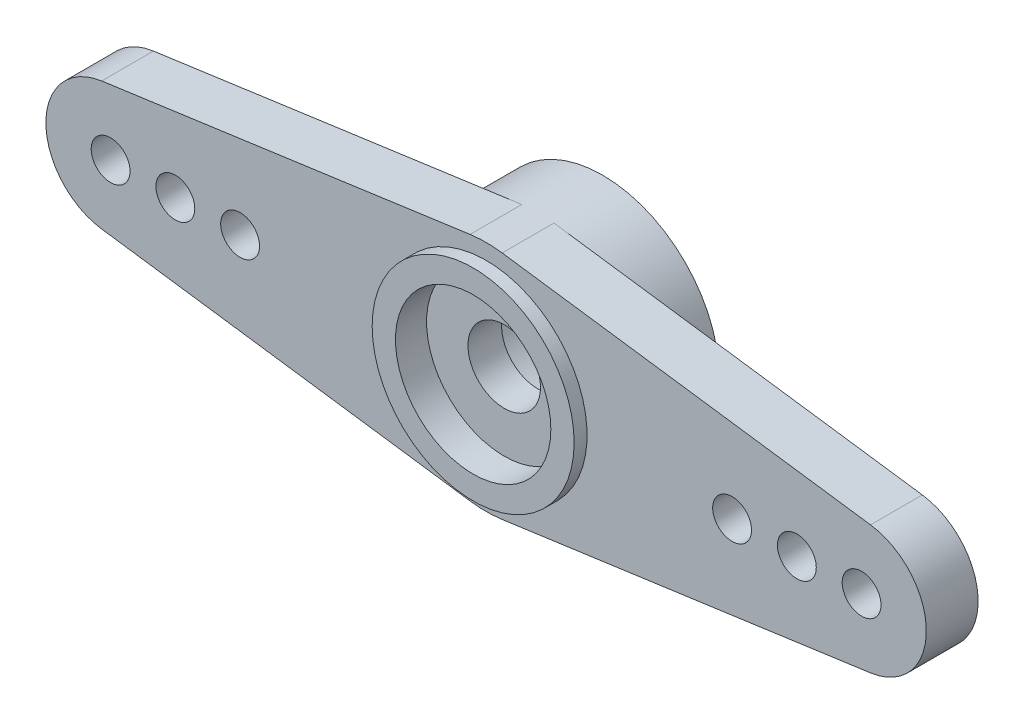
ISO-10303-21;
HEADER;
FILE_DESCRIPTION(('STEP AP214'),'2;1');
FILE_NAME('part.step','',(''),(''),'','','');
FILE_SCHEMA(('AUTOMOTIVE_DESIGN { 1 0 10303 214 1 1 1 1 }'));
ENDSEC;
DATA;
#1=APPLICATION_CONTEXT('core data for automotive mechanical design processes');
#2=APPLICATION_PROTOCOL_DEFINITION('international standard','automotive_design',2000,#1);
#3=PRODUCT_CONTEXT('',#1,'mechanical');
#4=PRODUCT('Part','Part','',(#3));
#5=PRODUCT_RELATED_PRODUCT_CATEGORY('part','',(#4));
#6=PRODUCT_DEFINITION_FORMATION('','',#4);
#7=PRODUCT_DEFINITION_CONTEXT('part definition',#1,'design');
#8=PRODUCT_DEFINITION('design','',#6,#7);
#9=PRODUCT_DEFINITION_SHAPE('','',#8);
#10=(LENGTH_UNIT() NAMED_UNIT(*) SI_UNIT(.MILLI.,.METRE.));
#11=(NAMED_UNIT(*) PLANE_ANGLE_UNIT() SI_UNIT($,.RADIAN.));
#12=(NAMED_UNIT(*) SI_UNIT($,.STERADIAN.) SOLID_ANGLE_UNIT());
#13=UNCERTAINTY_MEASURE_WITH_UNIT(LENGTH_MEASURE(1.E-05),#10,'distance_accuracy_value','');
#14=(GEOMETRIC_REPRESENTATION_CONTEXT(3) GLOBAL_UNCERTAINTY_ASSIGNED_CONTEXT((#13)) GLOBAL_UNIT_ASSIGNED_CONTEXT((#10,
#11,#12)) REPRESENTATION_CONTEXT('',''));
#15=CARTESIAN_POINT('',(0.,0.,0.));
#16=DIRECTION('',(0.,0.,1.));
#17=DIRECTION('',(1.,0.,0.));
#18=AXIS2_PLACEMENT_3D('',#15,#16,#17);
#19=CARTESIAN_POINT('',(0.,0.,0.));
#20=DIRECTION('',(0.,0.,-1.));
#21=DIRECTION('',(-1.,0.,0.));
#22=AXIS2_PLACEMENT_3D('',#19,#20,#21);
#23=PLANE('',#22);
#24=CARTESIAN_POINT('',(0.,0.,0.));
#25=DIRECTION('',(0.,0.,-1.));
#26=DIRECTION('',(-1.,0.,0.));
#27=AXIS2_PLACEMENT_3D('',#24,#25,#26);
#28=CIRCLE('',#27,4.5);
#29=CARTESIAN_POINT('',(0.620689655172413,4.45698826024502,0.));
#30=VERTEX_POINT('',#29);
#31=CARTESIAN_POINT('',(0.620689655172414,-4.45698826024502,0.));
#32=VERTEX_POINT('',#31);
#33=EDGE_CURVE('E11',#30,#32,#28,.T.);
#34=ORIENTED_EDGE('',*,*,#33,.F.);
#35=DIRECTION('',(-0.990441835610005,0.137931034482759,0.));
#36=VECTOR('',#35,1.);
#37=CARTESIAN_POINT('',(14.8448275862069,2.47610458902501,0.));
#38=LINE('',#37,#36);
#39=CARTESIAN_POINT('',(14.8448275862069,2.47610458902501,0.));
#40=VERTEX_POINT('',#39);
#41=EDGE_CURVE('E140',#40,#30,#38,.T.);
#42=ORIENTED_EDGE('',*,*,#41,.F.);
#43=CARTESIAN_POINT('',(14.5,0.,0.));
#44=DIRECTION('',(0.,0.,1.));
#45=DIRECTION('',(-1.,0.,0.));
#46=AXIS2_PLACEMENT_3D('',#43,#44,#45);
#47=CIRCLE('',#46,2.5);
#48=CARTESIAN_POINT('',(14.8448275862069,-2.47610458902501,0.));
#49=VERTEX_POINT('',#48);
#50=EDGE_CURVE('E78',#49,#40,#47,.T.);
#51=ORIENTED_EDGE('',*,*,#50,.F.);
#52=DIRECTION('',(0.990441835610005,0.137931034482759,0.));
#53=VECTOR('',#52,1.);
#54=CARTESIAN_POINT('',(0.620689655172413,-4.45698826024502,0.));
#55=LINE('',#54,#53);
#56=EDGE_CURVE('E120',#32,#49,#55,.T.);
#57=ORIENTED_EDGE('',*,*,#56,.F.);
#58=EDGE_LOOP('',(#34,#42,#51,#57));
#59=FACE_BOUND('',#58,.T.);
#60=CARTESIAN_POINT('',(12.,0.,0.));
#61=DIRECTION('',(0.,0.,1.));
#62=DIRECTION('',(1.,0.,0.));
#63=AXIS2_PLACEMENT_3D('',#60,#61,#62);
#64=CIRCLE('',#63,0.75);
#65=CARTESIAN_POINT('',(12.75,0.,0.));
#66=VERTEX_POINT('',#65);
#67=EDGE_CURVE('E177',#66,#66,#64,.T.);
#68=ORIENTED_EDGE('',*,*,#67,.T.);
#69=EDGE_LOOP('',(#68));
#70=FACE_BOUND('',#69,.T.);
#71=CARTESIAN_POINT('',(14.5,0.,0.));
#72=DIRECTION('',(0.,0.,1.));
#73=DIRECTION('',(1.,0.,0.));
#74=AXIS2_PLACEMENT_3D('',#71,#72,#73);
#75=CIRCLE('',#74,0.75);
#76=CARTESIAN_POINT('',(15.25,0.,0.));
#77=VERTEX_POINT('',#76);
#78=EDGE_CURVE('E208',#77,#77,#75,.T.);
#79=ORIENTED_EDGE('',*,*,#78,.T.);
#80=EDGE_LOOP('',(#79));
#81=FACE_BOUND('',#80,.T.);
#82=CARTESIAN_POINT('',(9.5,0.,0.));
#83=DIRECTION('',(0.,0.,1.));
#84=DIRECTION('',(1.,0.,0.));
#85=AXIS2_PLACEMENT_3D('',#82,#83,#84);
#86=CIRCLE('',#85,0.75);
#87=CARTESIAN_POINT('',(10.25,0.,0.));
#88=VERTEX_POINT('',#87);
#89=EDGE_CURVE('E181',#88,#88,#86,.T.);
#90=ORIENTED_EDGE('',*,*,#89,.T.);
#91=EDGE_LOOP('',(#90));
#92=FACE_BOUND('',#91,.T.);
#93=ADVANCED_FACE('F32',(#59,#70,#81,#92),#23,.T.);
#94=CARTESIAN_POINT('',(0.,0.,0.));
#95=DIRECTION('',(0.,0.,1.));
#96=DIRECTION('',(1.,0.,0.));
#97=AXIS2_PLACEMENT_3D('',#94,#95,#96);
#98=CIRCLE('',#97,1.4);
#99=CARTESIAN_POINT('',(1.4,0.,0.));
#100=VERTEX_POINT('',#99);
#101=EDGE_CURVE('E199',#100,#100,#98,.T.);
#102=ORIENTED_EDGE('',*,*,#101,.T.);
#103=EDGE_LOOP('',(#102));
#104=FACE_BOUND('',#103,.T.);
#105=CARTESIAN_POINT('',(0.,0.,0.));
#106=DIRECTION('',(0.,0.,-1.));
#107=DIRECTION('',(-1.,0.,0.));
#108=AXIS2_PLACEMENT_3D('',#105,#106,#107);
#109=CIRCLE('',#108,2.75);
#110=CARTESIAN_POINT('',(-2.75,0.,0.));
#111=VERTEX_POINT('',#110);
#112=EDGE_CURVE('E460',#111,#111,#109,.T.);
#113=ORIENTED_EDGE('',*,*,#112,.T.);
#114=EDGE_LOOP('',(#113));
#115=FACE_BOUND('',#114,.T.);
#116=ADVANCED_FACE('F242',(#104,#115),#23,.T.);
#117=CARTESIAN_POINT('',(0.,0.,2.));
#118=DIRECTION('',(0.,0.,-1.));
#119=DIRECTION('',(-1.,0.,0.));
#120=AXIS2_PLACEMENT_3D('',#117,#118,#119);
#121=CYLINDRICAL_SURFACE('',#120,1.4);
#122=ORIENTED_EDGE('',*,*,#101,.F.);
#123=EDGE_LOOP('',(#122));
#124=FACE_BOUND('',#123,.T.);
#125=CARTESIAN_POINT('',(0.,0.,1.3));
#126=DIRECTION('',(0.,0.,1.));
#127=DIRECTION('',(1.,0.,0.));
#128=AXIS2_PLACEMENT_3D('',#125,#126,#127);
#129=CIRCLE('',#128,1.4);
#130=CARTESIAN_POINT('',(1.4,0.,1.3));
#131=VERTEX_POINT('',#130);
#132=EDGE_CURVE('E36',#131,#131,#129,.T.);
#133=ORIENTED_EDGE('',*,*,#132,.T.);
#134=EDGE_LOOP('',(#133));
#135=FACE_BOUND('',#134,.T.);
#136=ADVANCED_FACE('F269',(#124,#135),#121,.F.);
#137=CARTESIAN_POINT('',(0.,0.,2.));
#138=DIRECTION('',(0.,0.,-1.));
#139=DIRECTION('',(-1.,0.,0.));
#140=AXIS2_PLACEMENT_3D('',#137,#138,#139);
#141=PLANE('',#140);
#142=CARTESIAN_POINT('',(0.,0.,2.));
#143=DIRECTION('',(0.,0.,-1.));
#144=DIRECTION('',(-1.,0.,0.));
#145=AXIS2_PLACEMENT_3D('',#142,#143,#144);
#146=CIRCLE('',#145,3.9);
#147=CARTESIAN_POINT('',(-3.9,0.,2.));
#148=VERTEX_POINT('',#147);
#149=EDGE_CURVE('E157',#148,#148,#146,.F.);
#150=ORIENTED_EDGE('',*,*,#149,.F.);
#151=EDGE_LOOP('',(#150));
#152=FACE_BOUND('',#151,.T.);
#153=CARTESIAN_POINT('',(0.,0.,2.));
#154=DIRECTION('',(0.,0.,1.));
#155=DIRECTION('',(-1.,0.,0.));
#156=AXIS2_PLACEMENT_3D('',#153,#154,#155);
#157=CIRCLE('',#156,4.5);
#158=CARTESIAN_POINT('',(0.620689655172413,4.45698826024502,2.));
#159=VERTEX_POINT('',#158);
#160=CARTESIAN_POINT('',(-0.620689655172413,4.45698826024502,2.));
#161=VERTEX_POINT('',#160);
#162=EDGE_CURVE('E142',#159,#161,#157,.T.);
#163=ORIENTED_EDGE('',*,*,#162,.T.);
#164=DIRECTION('',(-0.990441835610005,-0.137931034482758,0.));
#165=VECTOR('',#164,1.);
#166=CARTESIAN_POINT('',(-0.620689655172413,4.45698826024502,2.));
#167=LINE('',#166,#165);
#168=CARTESIAN_POINT('',(-14.8448275862069,2.47610458902501,2.));
#169=VERTEX_POINT('',#168);
#170=EDGE_CURVE('E93',#161,#169,#167,.T.);
#171=ORIENTED_EDGE('',*,*,#170,.T.);
#172=CARTESIAN_POINT('',(-14.5,0.,2.));
#173=DIRECTION('',(0.,0.,1.));
#174=DIRECTION('',(1.,0.,0.));
#175=AXIS2_PLACEMENT_3D('',#172,#173,#174);
#176=CIRCLE('',#175,2.5);
#177=CARTESIAN_POINT('',(-14.8448275862069,-2.47610458902501,2.));
#178=VERTEX_POINT('',#177);
#179=EDGE_CURVE('E217',#169,#178,#176,.T.);
#180=ORIENTED_EDGE('',*,*,#179,.T.);
#181=DIRECTION('',(0.990441835610005,-0.137931034482758,0.));
#182=VECTOR('',#181,1.);
#183=CARTESIAN_POINT('',(-14.8448275862069,-2.47610458902501,2.));
#184=LINE('',#183,#182);
#185=CARTESIAN_POINT('',(-0.620689655172413,-4.45698826024502,2.));
#186=VERTEX_POINT('',#185);
#187=EDGE_CURVE('E219',#178,#186,#184,.T.);
#188=ORIENTED_EDGE('',*,*,#187,.T.);
#189=CARTESIAN_POINT('',(0.,0.,2.));
#190=DIRECTION('',(0.,0.,1.));
#191=DIRECTION('',(-1.,0.,0.));
#192=AXIS2_PLACEMENT_3D('',#189,#190,#191);
#193=CIRCLE('',#192,4.5);
#194=CARTESIAN_POINT('',(0.620689655172414,-4.45698826024502,2.));
#195=VERTEX_POINT('',#194);
#196=EDGE_CURVE('E114',#186,#195,#193,.T.);
#197=ORIENTED_EDGE('',*,*,#196,.T.);
#198=DIRECTION('',(0.990441835610005,0.137931034482759,0.));
#199=VECTOR('',#198,1.);
#200=CARTESIAN_POINT('',(0.620689655172413,-4.45698826024502,2.));
#201=LINE('',#200,#199);
#202=CARTESIAN_POINT('',(14.8448275862069,-2.47610458902501,2.));
#203=VERTEX_POINT('',#202);
#204=EDGE_CURVE('E107',#195,#203,#201,.T.);
#205=ORIENTED_EDGE('',*,*,#204,.T.);
#206=CARTESIAN_POINT('',(14.5,0.,2.));
#207=DIRECTION('',(0.,0.,1.));
#208=DIRECTION('',(-1.,0.,0.));
#209=AXIS2_PLACEMENT_3D('',#206,#207,#208);
#210=CIRCLE('',#209,2.5);
#211=CARTESIAN_POINT('',(14.8448275862069,2.47610458902501,2.));
#212=VERTEX_POINT('',#211);
#213=EDGE_CURVE('E112',#203,#212,#210,.T.);
#214=ORIENTED_EDGE('',*,*,#213,.T.);
#215=DIRECTION('',(-0.990441835610005,0.137931034482759,0.));
#216=VECTOR('',#215,1.);
#217=CARTESIAN_POINT('',(14.8448275862069,2.47610458902501,2.));
#218=LINE('',#217,#216);
#219=EDGE_CURVE('E51',#212,#159,#218,.T.);
#220=ORIENTED_EDGE('',*,*,#219,.T.);
#221=EDGE_LOOP('',(#163,#171,#180,#188,#197,#205,#214,#220));
#222=FACE_BOUND('',#221,.T.);
#223=CARTESIAN_POINT('',(14.5,0.,2.));
#224=DIRECTION('',(0.,0.,1.));
#225=DIRECTION('',(1.,0.,0.));
#226=AXIS2_PLACEMENT_3D('',#223,#224,#225);
#227=CIRCLE('',#226,0.75);
#228=CARTESIAN_POINT('',(15.25,0.,2.));
#229=VERTEX_POINT('',#228);
#230=EDGE_CURVE('E133',#229,#229,#227,.T.);
#231=ORIENTED_EDGE('',*,*,#230,.F.);
#232=EDGE_LOOP('',(#231));
#233=FACE_BOUND('',#232,.T.);
#234=CARTESIAN_POINT('',(-12.,0.,2.));
#235=DIRECTION('',(0.,0.,1.));
#236=DIRECTION('',(1.,0.,0.));
#237=AXIS2_PLACEMENT_3D('',#234,#235,#236);
#238=CIRCLE('',#237,0.75);
#239=CARTESIAN_POINT('',(-11.25,0.,2.));
#240=VERTEX_POINT('',#239);
#241=EDGE_CURVE('E205',#240,#240,#238,.T.);
#242=ORIENTED_EDGE('',*,*,#241,.F.);
#243=EDGE_LOOP('',(#242));
#244=FACE_BOUND('',#243,.T.);
#245=CARTESIAN_POINT('',(-14.5,0.,2.));
#246=DIRECTION('',(0.,0.,1.));
#247=DIRECTION('',(1.,0.,0.));
#248=AXIS2_PLACEMENT_3D('',#245,#246,#247);
#249=CIRCLE('',#248,0.75);
#250=CARTESIAN_POINT('',(-13.75,0.,2.));
#251=VERTEX_POINT('',#250);
#252=EDGE_CURVE('E196',#251,#251,#249,.T.);
#253=ORIENTED_EDGE('',*,*,#252,.F.);
#254=EDGE_LOOP('',(#253));
#255=FACE_BOUND('',#254,.T.);
#256=CARTESIAN_POINT('',(-9.5,0.,2.));
#257=DIRECTION('',(0.,0.,1.));
#258=DIRECTION('',(1.,0.,0.));
#259=AXIS2_PLACEMENT_3D('',#256,#257,#258);
#260=CIRCLE('',#259,0.75);
#261=CARTESIAN_POINT('',(-8.75,0.,2.));
#262=VERTEX_POINT('',#261);
#263=EDGE_CURVE('E190',#262,#262,#260,.T.);
#264=ORIENTED_EDGE('',*,*,#263,.F.);
#265=EDGE_LOOP('',(#264));
#266=FACE_BOUND('',#265,.T.);
#267=CARTESIAN_POINT('',(9.5,0.,2.));
#268=DIRECTION('',(0.,0.,1.));
#269=DIRECTION('',(1.,0.,0.));
#270=AXIS2_PLACEMENT_3D('',#267,#268,#269);
#271=CIRCLE('',#270,0.75);
#272=CARTESIAN_POINT('',(10.25,0.,2.));
#273=VERTEX_POINT('',#272);
#274=EDGE_CURVE('E184',#273,#273,#271,.T.);
#275=ORIENTED_EDGE('',*,*,#274,.F.);
#276=EDGE_LOOP('',(#275));
#277=FACE_BOUND('',#276,.T.);
#278=CARTESIAN_POINT('',(12.,0.,2.));
#279=DIRECTION('',(0.,0.,1.));
#280=DIRECTION('',(1.,0.,0.));
#281=AXIS2_PLACEMENT_3D('',#278,#279,#280);
#282=CIRCLE('',#281,0.75);
#283=CARTESIAN_POINT('',(12.75,0.,2.));
#284=VERTEX_POINT('',#283);
#285=EDGE_CURVE('E178',#284,#284,#282,.T.);
#286=ORIENTED_EDGE('',*,*,#285,.F.);
#287=EDGE_LOOP('',(#286));
#288=FACE_BOUND('',#287,.T.);
#289=ADVANCED_FACE('F109',(#152,#222,#233,#244,#255,#266,#277,#288),#141,.F.);
#290=CARTESIAN_POINT('',(-0.620689655172413,-4.45698826024502,0.));
#291=VERTEX_POINT('',#290);
#292=CARTESIAN_POINT('',(-0.620689655172413,4.45698826024502,0.));
#293=VERTEX_POINT('',#292);
#294=EDGE_CURVE('E42',#291,#293,#28,.T.);
#295=ORIENTED_EDGE('',*,*,#294,.F.);
#296=DIRECTION('',(0.990441835610005,-0.137931034482758,0.));
#297=VECTOR('',#296,1.);
#298=CARTESIAN_POINT('',(-14.8448275862069,-2.47610458902501,0.));
#299=LINE('',#298,#297);
#300=CARTESIAN_POINT('',(-14.8448275862069,-2.47610458902501,0.));
#301=VERTEX_POINT('',#300);
#302=EDGE_CURVE('E135',#301,#291,#299,.T.);
#303=ORIENTED_EDGE('',*,*,#302,.F.);
#304=CARTESIAN_POINT('',(-14.5,0.,0.));
#305=DIRECTION('',(0.,0.,1.));
#306=DIRECTION('',(1.,0.,0.));
#307=AXIS2_PLACEMENT_3D('',#304,#305,#306);
#308=CIRCLE('',#307,2.5);
#309=CARTESIAN_POINT('',(-14.8448275862069,2.47610458902501,0.));
#310=VERTEX_POINT('',#309);
#311=EDGE_CURVE('E132',#310,#301,#308,.T.);
#312=ORIENTED_EDGE('',*,*,#311,.F.);
#313=DIRECTION('',(-0.990441835610005,-0.137931034482758,0.));
#314=VECTOR('',#313,1.);
#315=CARTESIAN_POINT('',(-0.620689655172413,4.45698826024502,0.));
#316=LINE('',#315,#314);
#317=EDGE_CURVE('E130',#293,#310,#316,.T.);
#318=ORIENTED_EDGE('',*,*,#317,.F.);
#319=EDGE_LOOP('',(#295,#303,#312,#318));
#320=FACE_BOUND('',#319,.T.);
#321=CARTESIAN_POINT('',(-14.5,0.,0.));
#322=DIRECTION('',(0.,0.,1.));
#323=DIRECTION('',(1.,0.,0.));
#324=AXIS2_PLACEMENT_3D('',#321,#322,#323);
#325=CIRCLE('',#324,0.75);
#326=CARTESIAN_POINT('',(-13.75,0.,0.));
#327=VERTEX_POINT('',#326);
#328=EDGE_CURVE('E193',#327,#327,#325,.T.);
#329=ORIENTED_EDGE('',*,*,#328,.T.);
#330=EDGE_LOOP('',(#329));
#331=FACE_BOUND('',#330,.T.);
#332=CARTESIAN_POINT('',(-12.,0.,0.));
#333=DIRECTION('',(0.,0.,1.));
#334=DIRECTION('',(1.,0.,0.));
#335=AXIS2_PLACEMENT_3D('',#332,#333,#334);
#336=CIRCLE('',#335,0.75);
#337=CARTESIAN_POINT('',(-11.25,0.,0.));
#338=VERTEX_POINT('',#337);
#339=EDGE_CURVE('E204',#338,#338,#336,.T.);
#340=ORIENTED_EDGE('',*,*,#339,.T.);
#341=EDGE_LOOP('',(#340));
#342=FACE_BOUND('',#341,.T.);
#343=CARTESIAN_POINT('',(-9.5,0.,0.));
#344=DIRECTION('',(0.,0.,1.));
#345=DIRECTION('',(1.,0.,0.));
#346=AXIS2_PLACEMENT_3D('',#343,#344,#345);
#347=CIRCLE('',#346,0.75);
#348=CARTESIAN_POINT('',(-8.75,0.,0.));
#349=VERTEX_POINT('',#348);
#350=EDGE_CURVE('E187',#349,#349,#347,.T.);
#351=ORIENTED_EDGE('',*,*,#350,.T.);
#352=EDGE_LOOP('',(#351));
#353=FACE_BOUND('',#352,.T.);
#354=ADVANCED_FACE('F238',(#320,#331,#342,#353),#23,.T.);
#355=CARTESIAN_POINT('',(-0.620689655172413,4.45698826024502,2.));
#356=DIRECTION('',(0.137931034482758,-0.990441835610005,0.));
#357=DIRECTION('',(0.990441835610005,0.137931034482759,0.));
#358=AXIS2_PLACEMENT_3D('',#355,#356,#357);
#359=PLANE('',#358);
#360=ORIENTED_EDGE('',*,*,#317,.T.);
#361=DIRECTION('',(0.,0.,-1.));
#362=VECTOR('',#361,1.);
#363=CARTESIAN_POINT('',(-14.8448275862069,2.47610458902501,2.));
#364=LINE('',#363,#362);
#365=EDGE_CURVE('E153',#169,#310,#364,.T.);
#366=ORIENTED_EDGE('',*,*,#365,.F.);
#367=ORIENTED_EDGE('',*,*,#170,.F.);
#368=DIRECTION('',(0.,0.,-1.));
#369=VECTOR('',#368,1.);
#370=CARTESIAN_POINT('',(-0.620689655172413,4.45698826024502,2.));
#371=LINE('',#370,#369);
#372=EDGE_CURVE('E156',#161,#293,#371,.T.);
#373=ORIENTED_EDGE('',*,*,#372,.T.);
#374=EDGE_LOOP('',(#360,#366,#367,#373));
#375=FACE_BOUND('',#374,.T.);
#376=ADVANCED_FACE('F34',(#375),#359,.F.);
#377=CARTESIAN_POINT('',(-14.5,0.,2.));
#378=DIRECTION('',(0.,0.,-1.));
#379=DIRECTION('',(-1.,0.,0.));
#380=AXIS2_PLACEMENT_3D('',#377,#378,#379);
#381=CYLINDRICAL_SURFACE('',#380,2.5);
#382=ORIENTED_EDGE('',*,*,#311,.T.);
#383=DIRECTION('',(0.,0.,-1.));
#384=VECTOR('',#383,1.);
#385=CARTESIAN_POINT('',(-14.8448275862069,-2.47610458902501,2.));
#386=LINE('',#385,#384);
#387=EDGE_CURVE('E150',#178,#301,#386,.T.);
#388=ORIENTED_EDGE('',*,*,#387,.F.);
#389=ORIENTED_EDGE('',*,*,#179,.F.);
#390=ORIENTED_EDGE('',*,*,#365,.T.);
#391=EDGE_LOOP('',(#382,#388,#389,#390));
#392=FACE_BOUND('',#391,.T.);
#393=ADVANCED_FACE('F236',(#392),#381,.T.);
#394=CARTESIAN_POINT('',(-14.8448275862069,-2.47610458902501,2.));
#395=DIRECTION('',(0.137931034482758,0.990441835610005,0.));
#396=DIRECTION('',(-0.990441835610005,0.137931034482759,0.));
#397=AXIS2_PLACEMENT_3D('',#394,#395,#396);
#398=PLANE('',#397);
#399=ORIENTED_EDGE('',*,*,#302,.T.);
#400=DIRECTION('',(0.,0.,-1.));
#401=VECTOR('',#400,1.);
#402=CARTESIAN_POINT('',(-0.620689655172413,-4.45698826024502,2.));
#403=LINE('',#402,#401);
#404=EDGE_CURVE('E147',#186,#291,#403,.T.);
#405=ORIENTED_EDGE('',*,*,#404,.F.);
#406=ORIENTED_EDGE('',*,*,#187,.F.);
#407=ORIENTED_EDGE('',*,*,#387,.T.);
#408=EDGE_LOOP('',(#399,#405,#406,#407));
#409=FACE_BOUND('',#408,.T.);
#410=ADVANCED_FACE('F225',(#409),#398,.F.);
#411=CARTESIAN_POINT('',(0.,0.,2.));
#412=DIRECTION('',(0.,0.,-1.));
#413=DIRECTION('',(-1.,0.,0.));
#414=AXIS2_PLACEMENT_3D('',#411,#412,#413);
#415=CYLINDRICAL_SURFACE('',#414,4.5);
#416=ORIENTED_EDGE('',*,*,#404,.T.);
#417=ORIENTED_EDGE('',*,*,#294,.T.);
#418=ORIENTED_EDGE('',*,*,#372,.F.);
#419=ORIENTED_EDGE('',*,*,#162,.F.);
#420=DIRECTION('',(0.,0.,-1.));
#421=VECTOR('',#420,1.);
#422=CARTESIAN_POINT('',(0.620689655172413,4.45698826024502,2.));
#423=LINE('',#422,#421);
#424=EDGE_CURVE('E126',#159,#30,#423,.T.);
#425=ORIENTED_EDGE('',*,*,#424,.T.);
#426=ORIENTED_EDGE('',*,*,#33,.T.);
#427=DIRECTION('',(0.,0.,-1.));
#428=VECTOR('',#427,1.);
#429=CARTESIAN_POINT('',(0.620689655172414,-4.45698826024502,2.));
#430=LINE('',#429,#428);
#431=EDGE_CURVE('E121',#195,#32,#430,.T.);
#432=ORIENTED_EDGE('',*,*,#431,.F.);
#433=ORIENTED_EDGE('',*,*,#196,.F.);
#434=EDGE_LOOP('',(#416,#417,#418,#419,#425,#426,#432,#433));
#435=FACE_BOUND('',#434,.T.);
#436=CARTESIAN_POINT('',(0.,0.,-2.5));
#437=DIRECTION('',(0.,0.,-1.));
#438=DIRECTION('',(-1.,0.,0.));
#439=AXIS2_PLACEMENT_3D('',#436,#437,#438);
#440=CIRCLE('',#439,4.5);
#441=CARTESIAN_POINT('',(-4.5,0.,-2.5));
#442=VERTEX_POINT('',#441);
#443=EDGE_CURVE('E166',#442,#442,#440,.T.);
#444=ORIENTED_EDGE('',*,*,#443,.F.);
#445=EDGE_LOOP('',(#444));
#446=FACE_BOUND('',#445,.T.);
#447=ADVANCED_FACE('F227',(#435,#446),#415,.T.);
#448=CARTESIAN_POINT('',(0.620689655172413,-4.45698826024502,2.));
#449=DIRECTION('',(-0.137931034482759,0.990441835610005,0.));
#450=DIRECTION('',(-0.990441835610005,-0.137931034482759,0.));
#451=AXIS2_PLACEMENT_3D('',#448,#449,#450);
#452=PLANE('',#451);
#453=ORIENTED_EDGE('',*,*,#56,.T.);
#454=DIRECTION('',(0.,0.,-1.));
#455=VECTOR('',#454,1.);
#456=CARTESIAN_POINT('',(14.8448275862069,-2.47610458902501,2.));
#457=LINE('',#456,#455);
#458=EDGE_CURVE('E118',#203,#49,#457,.T.);
#459=ORIENTED_EDGE('',*,*,#458,.F.);
#460=ORIENTED_EDGE('',*,*,#204,.F.);
#461=ORIENTED_EDGE('',*,*,#431,.T.);
#462=EDGE_LOOP('',(#453,#459,#460,#461));
#463=FACE_BOUND('',#462,.T.);
#464=ADVANCED_FACE('F119',(#463),#452,.F.);
#465=CARTESIAN_POINT('',(14.5,0.,2.));
#466=DIRECTION('',(0.,0.,-1.));
#467=DIRECTION('',(-1.,0.,0.));
#468=AXIS2_PLACEMENT_3D('',#465,#466,#467);
#469=CYLINDRICAL_SURFACE('',#468,2.5);
#470=ORIENTED_EDGE('',*,*,#50,.T.);
#471=DIRECTION('',(0.,0.,-1.));
#472=VECTOR('',#471,1.);
#473=CARTESIAN_POINT('',(14.8448275862069,2.47610458902501,2.));
#474=LINE('',#473,#472);
#475=EDGE_CURVE('E122',#212,#40,#474,.T.);
#476=ORIENTED_EDGE('',*,*,#475,.F.);
#477=ORIENTED_EDGE('',*,*,#213,.F.);
#478=ORIENTED_EDGE('',*,*,#458,.T.);
#479=EDGE_LOOP('',(#470,#476,#477,#478));
#480=FACE_BOUND('',#479,.T.);
#481=ADVANCED_FACE('F124',(#480),#469,.T.);
#482=CARTESIAN_POINT('',(14.8448275862069,2.47610458902501,2.));
#483=DIRECTION('',(-0.137931034482759,-0.990441835610005,0.));
#484=DIRECTION('',(0.990441835610005,-0.137931034482759,0.));
#485=AXIS2_PLACEMENT_3D('',#482,#483,#484);
#486=PLANE('',#485);
#487=ORIENTED_EDGE('',*,*,#41,.T.);
#488=ORIENTED_EDGE('',*,*,#424,.F.);
#489=ORIENTED_EDGE('',*,*,#219,.F.);
#490=ORIENTED_EDGE('',*,*,#475,.T.);
#491=EDGE_LOOP('',(#487,#488,#489,#490));
#492=FACE_BOUND('',#491,.T.);
#493=ADVANCED_FACE('F231',(#492),#486,.F.);
#494=CARTESIAN_POINT('',(14.5,0.,2.));
#495=DIRECTION('',(0.,0.,-1.));
#496=DIRECTION('',(-1.,0.,0.));
#497=AXIS2_PLACEMENT_3D('',#494,#495,#496);
#498=CYLINDRICAL_SURFACE('',#497,0.75);
#499=ORIENTED_EDGE('',*,*,#230,.T.);
#500=EDGE_LOOP('',(#499));
#501=FACE_BOUND('',#500,.T.);
#502=ORIENTED_EDGE('',*,*,#78,.F.);
#503=EDGE_LOOP('',(#502));
#504=FACE_BOUND('',#503,.T.);
#505=ADVANCED_FACE('F276',(#501,#504),#498,.F.);
#506=CARTESIAN_POINT('',(-12.,0.,2.));
#507=DIRECTION('',(0.,0.,-1.));
#508=DIRECTION('',(-1.,0.,0.));
#509=AXIS2_PLACEMENT_3D('',#506,#507,#508);
#510=CYLINDRICAL_SURFACE('',#509,0.75);
#511=ORIENTED_EDGE('',*,*,#241,.T.);
#512=EDGE_LOOP('',(#511));
#513=FACE_BOUND('',#512,.T.);
#514=ORIENTED_EDGE('',*,*,#339,.F.);
#515=EDGE_LOOP('',(#514));
#516=FACE_BOUND('',#515,.T.);
#517=ADVANCED_FACE('F262',(#513,#516),#510,.F.);
#518=CARTESIAN_POINT('',(-14.5,0.,2.));
#519=DIRECTION('',(0.,0.,-1.));
#520=DIRECTION('',(-1.,0.,0.));
#521=AXIS2_PLACEMENT_3D('',#518,#519,#520);
#522=CYLINDRICAL_SURFACE('',#521,0.75);
#523=ORIENTED_EDGE('',*,*,#252,.T.);
#524=EDGE_LOOP('',(#523));
#525=FACE_BOUND('',#524,.T.);
#526=ORIENTED_EDGE('',*,*,#328,.F.);
#527=EDGE_LOOP('',(#526));
#528=FACE_BOUND('',#527,.T.);
#529=ADVANCED_FACE('F252',(#525,#528),#522,.F.);
#530=CARTESIAN_POINT('',(-9.5,0.,2.));
#531=DIRECTION('',(0.,0.,-1.));
#532=DIRECTION('',(-1.,0.,0.));
#533=AXIS2_PLACEMENT_3D('',#530,#531,#532);
#534=CYLINDRICAL_SURFACE('',#533,0.75);
#535=ORIENTED_EDGE('',*,*,#263,.T.);
#536=EDGE_LOOP('',(#535));
#537=FACE_BOUND('',#536,.T.);
#538=ORIENTED_EDGE('',*,*,#350,.F.);
#539=EDGE_LOOP('',(#538));
#540=FACE_BOUND('',#539,.T.);
#541=ADVANCED_FACE('F249',(#537,#540),#534,.F.);
#542=CARTESIAN_POINT('',(9.5,0.,2.));
#543=DIRECTION('',(0.,0.,-1.));
#544=DIRECTION('',(-1.,0.,0.));
#545=AXIS2_PLACEMENT_3D('',#542,#543,#544);
#546=CYLINDRICAL_SURFACE('',#545,0.75);
#547=ORIENTED_EDGE('',*,*,#274,.T.);
#548=EDGE_LOOP('',(#547));
#549=FACE_BOUND('',#548,.T.);
#550=ORIENTED_EDGE('',*,*,#89,.F.);
#551=EDGE_LOOP('',(#550));
#552=FACE_BOUND('',#551,.T.);
#553=ADVANCED_FACE('F251',(#549,#552),#546,.F.);
#554=CARTESIAN_POINT('',(12.,0.,2.));
#555=DIRECTION('',(0.,0.,-1.));
#556=DIRECTION('',(-1.,0.,0.));
#557=AXIS2_PLACEMENT_3D('',#554,#555,#556);
#558=CYLINDRICAL_SURFACE('',#557,0.75);
#559=ORIENTED_EDGE('',*,*,#285,.T.);
#560=EDGE_LOOP('',(#559));
#561=FACE_BOUND('',#560,.T.);
#562=ORIENTED_EDGE('',*,*,#67,.F.);
#563=EDGE_LOOP('',(#562));
#564=FACE_BOUND('',#563,.T.);
#565=ADVANCED_FACE('F259',(#561,#564),#558,.F.);
#566=CARTESIAN_POINT('',(0.,0.,2.5));
#567=DIRECTION('',(0.,0.,1.));
#568=DIRECTION('',(1.,0.,0.));
#569=AXIS2_PLACEMENT_3D('',#566,#567,#568);
#570=PLANE('',#569);
#571=CARTESIAN_POINT('',(0.,0.,2.5));
#572=DIRECTION('',(0.,0.,1.));
#573=DIRECTION('',(1.,0.,0.));
#574=AXIS2_PLACEMENT_3D('',#571,#572,#573);
#575=CIRCLE('',#574,3.9);
#576=CARTESIAN_POINT('',(3.9,0.,2.5));
#577=VERTEX_POINT('',#576);
#578=EDGE_CURVE('E174',#577,#577,#575,.T.);
#579=ORIENTED_EDGE('',*,*,#578,.T.);
#580=EDGE_LOOP('',(#579));
#581=FACE_BOUND('',#580,.T.);
#582=CARTESIAN_POINT('',(0.,0.,2.5));
#583=DIRECTION('',(0.,0.,1.));
#584=DIRECTION('',(1.,0.,0.));
#585=AXIS2_PLACEMENT_3D('',#582,#583,#584);
#586=CIRCLE('',#585,3.);
#587=CARTESIAN_POINT('',(3.,0.,2.5));
#588=VERTEX_POINT('',#587);
#589=EDGE_CURVE('E171',#588,#588,#586,.T.);
#590=ORIENTED_EDGE('',*,*,#589,.F.);
#591=EDGE_LOOP('',(#590));
#592=FACE_BOUND('',#591,.T.);
#593=ADVANCED_FACE('F351',(#581,#592),#570,.T.);
#594=CARTESIAN_POINT('',(0.,0.,2.5));
#595=DIRECTION('',(0.,0.,-1.));
#596=DIRECTION('',(-1.,0.,0.));
#597=AXIS2_PLACEMENT_3D('',#594,#595,#596);
#598=CYLINDRICAL_SURFACE('',#597,3.9);
#599=ORIENTED_EDGE('',*,*,#578,.F.);
#600=EDGE_LOOP('',(#599));
#601=FACE_BOUND('',#600,.T.);
#602=ORIENTED_EDGE('',*,*,#149,.T.);
#603=EDGE_LOOP('',(#602));
#604=FACE_BOUND('',#603,.T.);
#605=ADVANCED_FACE('F341',(#601,#604),#598,.T.);
#606=CARTESIAN_POINT('',(0.,0.,2.5));
#607=DIRECTION('',(0.,0.,-1.));
#608=DIRECTION('',(-1.,0.,0.));
#609=AXIS2_PLACEMENT_3D('',#606,#607,#608);
#610=CYLINDRICAL_SURFACE('',#609,3.);
#611=ORIENTED_EDGE('',*,*,#589,.T.);
#612=EDGE_LOOP('',(#611));
#613=FACE_BOUND('',#612,.T.);
#614=CARTESIAN_POINT('',(0.,0.,1.3));
#615=DIRECTION('',(0.,0.,1.));
#616=DIRECTION('',(1.,0.,0.));
#617=AXIS2_PLACEMENT_3D('',#614,#615,#616);
#618=CIRCLE('',#617,3.);
#619=CARTESIAN_POINT('',(3.,0.,1.3));
#620=VERTEX_POINT('',#619);
#621=EDGE_CURVE('E168',#620,#620,#618,.T.);
#622=ORIENTED_EDGE('',*,*,#621,.F.);
#623=EDGE_LOOP('',(#622));
#624=FACE_BOUND('',#623,.T.);
#625=ADVANCED_FACE('F331',(#613,#624),#610,.F.);
#626=CARTESIAN_POINT('',(0.,0.,1.3));
#627=DIRECTION('',(0.,0.,1.));
#628=DIRECTION('',(1.,0.,0.));
#629=AXIS2_PLACEMENT_3D('',#626,#627,#628);
#630=PLANE('',#629);
#631=ORIENTED_EDGE('',*,*,#132,.F.);
#632=EDGE_LOOP('',(#631));
#633=FACE_BOUND('',#632,.T.);
#634=ORIENTED_EDGE('',*,*,#621,.T.);
#635=EDGE_LOOP('',(#634));
#636=FACE_BOUND('',#635,.T.);
#637=ADVANCED_FACE('F327',(#633,#636),#630,.T.);
#638=CARTESIAN_POINT('',(0.,0.,-2.5));
#639=DIRECTION('',(0.,0.,-1.));
#640=DIRECTION('',(-1.,0.,0.));
#641=AXIS2_PLACEMENT_3D('',#638,#639,#640);
#642=PLANE('',#641);
#643=ORIENTED_EDGE('',*,*,#443,.T.);
#644=EDGE_LOOP('',(#643));
#645=FACE_BOUND('',#644,.T.);
#646=CARTESIAN_POINT('',(0.,0.,-2.5));
#647=DIRECTION('',(0.,0.,-1.));
#648=DIRECTION('',(-1.,0.,0.));
#649=AXIS2_PLACEMENT_3D('',#646,#647,#648);
#650=CIRCLE('',#649,2.75);
#651=CARTESIAN_POINT('',(-2.75,0.,-2.5));
#652=VERTEX_POINT('',#651);
#653=EDGE_CURVE('E457',#652,#652,#650,.T.);
#654=ORIENTED_EDGE('',*,*,#653,.F.);
#655=EDGE_LOOP('',(#654));
#656=FACE_BOUND('',#655,.T.);
#657=ADVANCED_FACE('F330',(#645,#656),#642,.T.);
#658=CARTESIAN_POINT('',(0.,0.,-2.5));
#659=DIRECTION('',(0.,0.,1.));
#660=DIRECTION('',(1.,0.,0.));
#661=AXIS2_PLACEMENT_3D('',#658,#659,#660);
#662=CYLINDRICAL_SURFACE('',#661,2.75);
#663=ORIENTED_EDGE('',*,*,#653,.T.);
#664=EDGE_LOOP('',(#663));
#665=FACE_BOUND('',#664,.T.);
#666=ORIENTED_EDGE('',*,*,#112,.F.);
#667=EDGE_LOOP('',(#666));
#668=FACE_BOUND('',#667,.T.);
#669=ADVANCED_FACE('F440',(#665,#668),#662,.F.);
#670=CLOSED_SHELL('',(#93,#116,#136,#289,#354,#376,#393,#410,#447,#464,#481,#493,#505,#517,#529,
#541,#553,#565,#593,#605,#625,#637,#657,#669));
#671=MANIFOLD_SOLID_BREP('B2',#670);
#672=ADVANCED_BREP_SHAPE_REPRESENTATION('',(#18,#671),#14);
#673=SHAPE_DEFINITION_REPRESENTATION(#9,#672);
ENDSEC;
END-ISO-10303-21;
